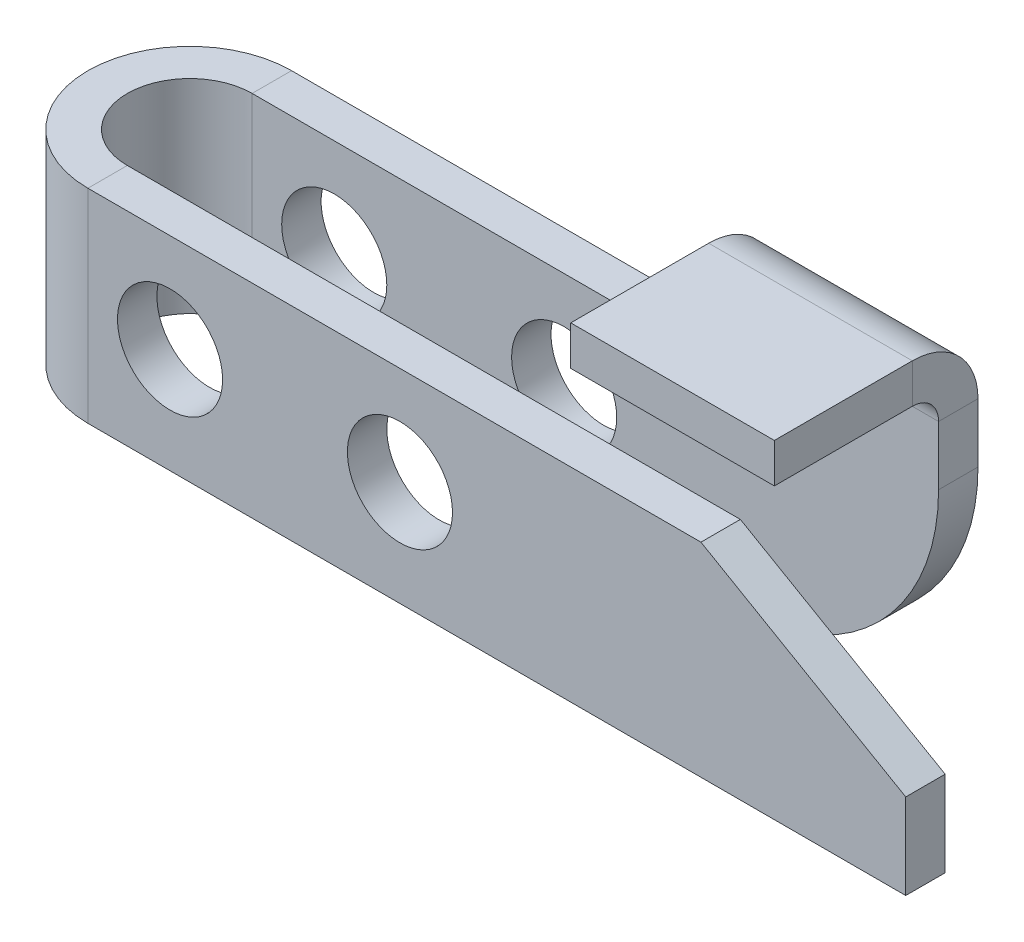
ISO-10303-21;
HEADER;
FILE_DESCRIPTION(('STEP AP214'),'2;1');
FILE_NAME('part.step','',(''),(''),'','','');
FILE_SCHEMA(('AUTOMOTIVE_DESIGN { 1 0 10303 214 1 1 1 1 }'));
ENDSEC;
DATA;
#1=APPLICATION_CONTEXT('core data for automotive mechanical design processes');
#2=APPLICATION_PROTOCOL_DEFINITION('international standard','automotive_design',2000,#1);
#3=PRODUCT_CONTEXT('',#1,'mechanical');
#4=PRODUCT('Part','Part','',(#3));
#5=PRODUCT_RELATED_PRODUCT_CATEGORY('part','',(#4));
#6=PRODUCT_DEFINITION_FORMATION('','',#4);
#7=PRODUCT_DEFINITION_CONTEXT('part definition',#1,'design');
#8=PRODUCT_DEFINITION('design','',#6,#7);
#9=PRODUCT_DEFINITION_SHAPE('','',#8);
#10=(LENGTH_UNIT() NAMED_UNIT(*) SI_UNIT(.MILLI.,.METRE.));
#11=(NAMED_UNIT(*) PLANE_ANGLE_UNIT() SI_UNIT($,.RADIAN.));
#12=(NAMED_UNIT(*) SI_UNIT($,.STERADIAN.) SOLID_ANGLE_UNIT());
#13=UNCERTAINTY_MEASURE_WITH_UNIT(LENGTH_MEASURE(1.E-05),#10,'distance_accuracy_value','');
#14=(GEOMETRIC_REPRESENTATION_CONTEXT(3) GLOBAL_UNCERTAINTY_ASSIGNED_CONTEXT((#13)) GLOBAL_UNIT_ASSIGNED_CONTEXT((#10,
#11,#12)) REPRESENTATION_CONTEXT('',''));
#15=CARTESIAN_POINT('',(0.,0.,0.));
#16=DIRECTION('',(0.,0.,1.));
#17=DIRECTION('',(1.,0.,0.));
#18=AXIS2_PLACEMENT_3D('',#15,#16,#17);
#19=CARTESIAN_POINT('',(-72.25,15.5,-31.));
#20=DIRECTION('',(0.,0.,-1.));
#21=DIRECTION('',(-1.,0.,0.));
#22=AXIS2_PLACEMENT_3D('',#19,#20,#21);
#23=PLANE('',#22);
#24=CARTESIAN_POINT('',(-112.,16.,-31.));
#25=DIRECTION('',(0.,0.,1.));
#26=DIRECTION('',(1.,0.,0.));
#27=AXIS2_PLACEMENT_3D('',#24,#25,#26);
#28=CIRCLE('',#27,8.00000000000001);
#29=CARTESIAN_POINT('',(-104.,16.,-31.));
#30=VERTEX_POINT('',#29);
#31=EDGE_CURVE('E771',#30,#30,#28,.T.);
#32=ORIENTED_EDGE('',*,*,#31,.T.);
#33=EDGE_LOOP('',(#32));
#34=FACE_BOUND('',#33,.T.);
#35=CARTESIAN_POINT('',(-77.,16.,-31.));
#36=DIRECTION('',(0.,0.,1.));
#37=DIRECTION('',(1.,0.,0.));
#38=AXIS2_PLACEMENT_3D('',#35,#36,#37);
#39=CIRCLE('',#38,8.00000000000001);
#40=CARTESIAN_POINT('',(-69.,16.,-31.));
#41=VERTEX_POINT('',#40);
#42=EDGE_CURVE('E776',#41,#41,#39,.T.);
#43=ORIENTED_EDGE('',*,*,#42,.T.);
#44=EDGE_LOOP('',(#43));
#45=FACE_BOUND('',#44,.T.);
#46=DIRECTION('',(0.,1.,0.));
#47=VECTOR('',#46,1.);
#48=CARTESIAN_POINT('',(-20.,15.5,-31.));
#49=LINE('',#48,#47);
#50=CARTESIAN_POINT('',(-20.,31.,-31.));
#51=VERTEX_POINT('',#50);
#52=CARTESIAN_POINT('',(-20.,40.,-31.));
#53=VERTEX_POINT('',#52);
#54=EDGE_CURVE('E265',#51,#53,#49,.T.);
#55=ORIENTED_EDGE('',*,*,#54,.F.);
#56=CARTESIAN_POINT('',(-51.,31.,-31.));
#57=DIRECTION('',(0.,0.,-1.));
#58=DIRECTION('',(-1.,0.,0.));
#59=AXIS2_PLACEMENT_3D('',#56,#57,#58);
#60=CIRCLE('',#59,31.);
#61=CARTESIAN_POINT('',(-51.,0.,-31.));
#62=VERTEX_POINT('',#61);
#63=EDGE_CURVE('E86',#51,#62,#60,.T.);
#64=ORIENTED_EDGE('',*,*,#63,.T.);
#65=DIRECTION('',(1.,0.,0.));
#66=VECTOR('',#65,1.);
#67=CARTESIAN_POINT('',(-72.25,0.,-31.));
#68=LINE('',#67,#66);
#69=CARTESIAN_POINT('',(-124.5,0.,-31.));
#70=VERTEX_POINT('',#69);
#71=EDGE_CURVE('E273',#70,#62,#68,.T.);
#72=ORIENTED_EDGE('',*,*,#71,.F.);
#73=DIRECTION('',(0.,-1.,0.));
#74=VECTOR('',#73,1.);
#75=CARTESIAN_POINT('',(-124.5,15.5,-31.));
#76=LINE('',#75,#74);
#77=CARTESIAN_POINT('',(-124.5,31.,-31.));
#78=VERTEX_POINT('',#77);
#79=EDGE_CURVE('E269',#78,#70,#76,.T.);
#80=ORIENTED_EDGE('',*,*,#79,.F.);
#81=DIRECTION('',(1.,0.,0.));
#82=VECTOR('',#81,1.);
#83=CARTESIAN_POINT('',(-72.25,31.,-31.));
#84=LINE('',#83,#82);
#85=CARTESIAN_POINT('',(-51.,31.,-31.));
#86=VERTEX_POINT('',#85);
#87=EDGE_CURVE('E206',#78,#86,#84,.T.);
#88=ORIENTED_EDGE('',*,*,#87,.T.);
#89=DIRECTION('',(0.,1.,0.));
#90=VECTOR('',#89,1.);
#91=CARTESIAN_POINT('',(-51.,15.5,-31.));
#92=LINE('',#91,#90);
#93=CARTESIAN_POINT('',(-51.,40.,-31.));
#94=VERTEX_POINT('',#93);
#95=EDGE_CURVE('E194',#86,#94,#92,.T.);
#96=ORIENTED_EDGE('',*,*,#95,.T.);
#97=DIRECTION('',(-1.,0.,0.));
#98=VECTOR('',#97,1.);
#99=CARTESIAN_POINT('',(-124.5,40.,-31.));
#100=LINE('',#99,#98);
#101=EDGE_CURVE('E203',#94,#53,#100,.F.);
#102=ORIENTED_EDGE('',*,*,#101,.T.);
#103=EDGE_LOOP('',(#55,#64,#72,#80,#88,#96,#102));
#104=FACE_BOUND('',#103,.T.);
#105=ADVANCED_FACE('F63',(#34,#45,#104),#23,.T.);
#106=CARTESIAN_POINT('',(-72.25,15.5,-25.));
#107=DIRECTION('',(0.,0.,-1.));
#108=DIRECTION('',(-1.,0.,0.));
#109=AXIS2_PLACEMENT_3D('',#106,#107,#108);
#110=PLANE('',#109);
#111=CARTESIAN_POINT('',(-112.,16.,-25.));
#112=DIRECTION('',(0.,0.,-1.));
#113=DIRECTION('',(-1.,0.,0.));
#114=AXIS2_PLACEMENT_3D('',#111,#112,#113);
#115=CIRCLE('',#114,8.00000000000001);
#116=CARTESIAN_POINT('',(-120.,16.,-25.));
#117=VERTEX_POINT('',#116);
#118=EDGE_CURVE('E721',#117,#117,#115,.T.);
#119=ORIENTED_EDGE('',*,*,#118,.T.);
#120=EDGE_LOOP('',(#119));
#121=FACE_BOUND('',#120,.T.);
#122=CARTESIAN_POINT('',(-77.,16.,-25.));
#123=DIRECTION('',(0.,0.,-1.));
#124=DIRECTION('',(-1.,0.,0.));
#125=AXIS2_PLACEMENT_3D('',#122,#123,#124);
#126=CIRCLE('',#125,8.00000000000001);
#127=CARTESIAN_POINT('',(-85.,16.,-25.));
#128=VERTEX_POINT('',#127);
#129=EDGE_CURVE('E761',#128,#128,#126,.T.);
#130=ORIENTED_EDGE('',*,*,#129,.T.);
#131=EDGE_LOOP('',(#130));
#132=FACE_BOUND('',#131,.T.);
#133=DIRECTION('',(-1.,0.,0.));
#134=VECTOR('',#133,1.);
#135=CARTESIAN_POINT('',(-72.25,0.,-25.));
#136=LINE('',#135,#134);
#137=CARTESIAN_POINT('',(-124.5,0.,-25.));
#138=VERTEX_POINT('',#137);
#139=CARTESIAN_POINT('',(-51.,0.,-25.));
#140=VERTEX_POINT('',#139);
#141=EDGE_CURVE('E261',#138,#140,#136,.F.);
#142=ORIENTED_EDGE('',*,*,#141,.T.);
#143=CARTESIAN_POINT('',(-51.,31.,-25.));
#144=DIRECTION('',(0.,0.,-1.));
#145=DIRECTION('',(-1.,0.,0.));
#146=AXIS2_PLACEMENT_3D('',#143,#144,#145);
#147=CIRCLE('',#146,31.);
#148=CARTESIAN_POINT('',(-20.,31.,-25.));
#149=VERTEX_POINT('',#148);
#150=EDGE_CURVE('E13',#140,#149,#147,.F.);
#151=ORIENTED_EDGE('',*,*,#150,.T.);
#152=DIRECTION('',(0.,1.,0.));
#153=VECTOR('',#152,1.);
#154=CARTESIAN_POINT('',(-20.,15.5,-25.));
#155=LINE('',#154,#153);
#156=CARTESIAN_POINT('',(-20.,40.,-25.));
#157=VERTEX_POINT('',#156);
#158=EDGE_CURVE('E276',#149,#157,#155,.T.);
#159=ORIENTED_EDGE('',*,*,#158,.T.);
#160=DIRECTION('',(-1.,0.,0.));
#161=VECTOR('',#160,1.);
#162=CARTESIAN_POINT('',(-124.5,40.,-25.));
#163=LINE('',#162,#161);
#164=CARTESIAN_POINT('',(-51.,40.,-25.));
#165=VERTEX_POINT('',#164);
#166=EDGE_CURVE('E222',#165,#157,#163,.F.);
#167=ORIENTED_EDGE('',*,*,#166,.F.);
#168=DIRECTION('',(0.,1.,0.));
#169=VECTOR('',#168,1.);
#170=CARTESIAN_POINT('',(-51.,35.5,-25.));
#171=LINE('',#170,#169);
#172=CARTESIAN_POINT('',(-51.,31.,-25.));
#173=VERTEX_POINT('',#172);
#174=EDGE_CURVE('E197',#173,#165,#171,.T.);
#175=ORIENTED_EDGE('',*,*,#174,.F.);
#176=DIRECTION('',(1.,0.,0.));
#177=VECTOR('',#176,1.);
#178=CARTESIAN_POINT('',(-87.75,31.,-25.));
#179=LINE('',#178,#177);
#180=CARTESIAN_POINT('',(-124.5,31.,-25.));
#181=VERTEX_POINT('',#180);
#182=EDGE_CURVE('E208',#181,#173,#179,.T.);
#183=ORIENTED_EDGE('',*,*,#182,.F.);
#184=DIRECTION('',(0.,1.,0.));
#185=VECTOR('',#184,1.);
#186=CARTESIAN_POINT('',(-124.5,15.5,-25.));
#187=LINE('',#186,#185);
#188=EDGE_CURVE('E279',#181,#138,#187,.F.);
#189=ORIENTED_EDGE('',*,*,#188,.T.);
#190=EDGE_LOOP('',(#142,#151,#159,#167,#175,#183,#189));
#191=FACE_BOUND('',#190,.T.);
#192=ADVANCED_FACE('F342',(#121,#132,#191),#110,.F.);
#193=CARTESIAN_POINT('',(-124.5,40.,-21.));
#194=DIRECTION('',(-1.,0.,0.));
#195=DIRECTION('',(0.,1.,0.));
#196=AXIS2_PLACEMENT_3D('',#193,#194,#195);
#197=CYLINDRICAL_SURFACE('',#196,10.);
#198=ORIENTED_EDGE('',*,*,#101,.F.);
#199=CARTESIAN_POINT('',(-51.,40.,-21.));
#200=DIRECTION('',(-1.,0.,0.));
#201=DIRECTION('',(0.,0.,1.));
#202=AXIS2_PLACEMENT_3D('',#199,#200,#201);
#203=CIRCLE('',#202,10.);
#204=CARTESIAN_POINT('',(-51.,50.,-21.));
#205=VERTEX_POINT('',#204);
#206=EDGE_CURVE('E176',#205,#94,#203,.T.);
#207=ORIENTED_EDGE('',*,*,#206,.F.);
#208=DIRECTION('',(-1.,0.,0.));
#209=VECTOR('',#208,1.);
#210=CARTESIAN_POINT('',(-20.,50.,-21.));
#211=LINE('',#210,#209);
#212=CARTESIAN_POINT('',(-20.,50.,-21.));
#213=VERTEX_POINT('',#212);
#214=EDGE_CURVE('E742',#205,#213,#211,.F.);
#215=ORIENTED_EDGE('',*,*,#214,.T.);
#216=CARTESIAN_POINT('',(-20.,40.,-21.));
#217=DIRECTION('',(-1.,0.,0.));
#218=DIRECTION('',(0.,0.,1.));
#219=AXIS2_PLACEMENT_3D('',#216,#217,#218);
#220=CIRCLE('',#219,10.);
#221=EDGE_CURVE('E212',#53,#213,#220,.F.);
#222=ORIENTED_EDGE('',*,*,#221,.F.);
#223=EDGE_LOOP('',(#198,#207,#215,#222));
#224=FACE_BOUND('',#223,.T.);
#225=ADVANCED_FACE('F210',(#224),#197,.T.);
#226=CARTESIAN_POINT('',(-124.5,40.,-21.));
#227=DIRECTION('',(-1.,0.,0.));
#228=DIRECTION('',(0.,1.,0.));
#229=AXIS2_PLACEMENT_3D('',#226,#227,#228);
#230=CYLINDRICAL_SURFACE('',#229,4.);
#231=CARTESIAN_POINT('',(-51.,40.,-21.));
#232=DIRECTION('',(-1.,0.,0.));
#233=DIRECTION('',(0.,0.,1.));
#234=AXIS2_PLACEMENT_3D('',#231,#232,#233);
#235=CIRCLE('',#234,4.);
#236=CARTESIAN_POINT('',(-51.,44.,-21.));
#237=VERTEX_POINT('',#236);
#238=EDGE_CURVE('E188',#237,#165,#235,.T.);
#239=ORIENTED_EDGE('',*,*,#238,.T.);
#240=ORIENTED_EDGE('',*,*,#166,.T.);
#241=CARTESIAN_POINT('',(-20.,40.,-21.));
#242=DIRECTION('',(-1.,0.,0.));
#243=DIRECTION('',(0.,0.,1.));
#244=AXIS2_PLACEMENT_3D('',#241,#242,#243);
#245=CIRCLE('',#244,4.);
#246=CARTESIAN_POINT('',(-20.,44.,-21.));
#247=VERTEX_POINT('',#246);
#248=EDGE_CURVE('E215',#157,#247,#245,.F.);
#249=ORIENTED_EDGE('',*,*,#248,.T.);
#250=DIRECTION('',(-1.,0.,0.));
#251=VECTOR('',#250,1.);
#252=CARTESIAN_POINT('',(-20.,44.,-21.));
#253=LINE('',#252,#251);
#254=EDGE_CURVE('E700',#247,#237,#253,.T.);
#255=ORIENTED_EDGE('',*,*,#254,.T.);
#256=EDGE_LOOP('',(#239,#240,#249,#255));
#257=FACE_BOUND('',#256,.T.);
#258=ADVANCED_FACE('F619',(#257),#230,.F.);
#259=CARTESIAN_POINT('',(0.,50.,-1.28501743543621E-13));
#260=DIRECTION('',(0.,-1.,0.));
#261=DIRECTION('',(0.,0.,-1.));
#262=AXIS2_PLACEMENT_3D('',#259,#260,#261);
#263=PLANE('',#262);
#264=DIRECTION('',(0.,0.,1.));
#265=VECTOR('',#264,1.);
#266=CARTESIAN_POINT('',(-51.,50.,-10.5000000000001));
#267=LINE('',#266,#265);
#268=CARTESIAN_POINT('',(-51.,50.,-1.28369537222284E-13));
#269=VERTEX_POINT('',#268);
#270=EDGE_CURVE('E719',#269,#205,#267,.F.);
#271=ORIENTED_EDGE('',*,*,#270,.F.);
#272=DIRECTION('',(1.,0.,0.));
#273=VECTOR('',#272,1.);
#274=CARTESIAN_POINT('',(0.,50.,-1.28501743543621E-13));
#275=LINE('',#274,#273);
#276=CARTESIAN_POINT('',(-20.,50.,0.));
#277=VERTEX_POINT('',#276);
#278=EDGE_CURVE('E728',#269,#277,#275,.T.);
#279=ORIENTED_EDGE('',*,*,#278,.T.);
#280=DIRECTION('',(0.,0.,-1.));
#281=VECTOR('',#280,1.);
#282=CARTESIAN_POINT('',(-20.,50.,-1.28501743543621E-13));
#283=LINE('',#282,#281);
#284=EDGE_CURVE('E731',#277,#213,#283,.T.);
#285=ORIENTED_EDGE('',*,*,#284,.T.);
#286=ORIENTED_EDGE('',*,*,#214,.F.);
#287=EDGE_LOOP('',(#271,#279,#285,#286));
#288=FACE_BOUND('',#287,.T.);
#289=ADVANCED_FACE('F608',(#288),#263,.F.);
#290=CARTESIAN_POINT('',(0.,44.,-1.07552855510562E-13));
#291=DIRECTION('',(0.,-1.,0.));
#292=DIRECTION('',(0.,0.,-1.));
#293=AXIS2_PLACEMENT_3D('',#290,#291,#292);
#294=PLANE('',#293);
#295=DIRECTION('',(-1.,0.,0.));
#296=VECTOR('',#295,1.);
#297=CARTESIAN_POINT('',(-20.,44.,0.));
#298=LINE('',#297,#296);
#299=CARTESIAN_POINT('',(-51.,44.,0.));
#300=VERTEX_POINT('',#299);
#301=CARTESIAN_POINT('',(-20.,44.,0.));
#302=VERTEX_POINT('',#301);
#303=EDGE_CURVE('E735',#300,#302,#298,.F.);
#304=ORIENTED_EDGE('',*,*,#303,.F.);
#305=DIRECTION('',(0.,0.,-1.));
#306=VECTOR('',#305,1.);
#307=CARTESIAN_POINT('',(-51.,44.,-31.));
#308=LINE('',#307,#306);
#309=EDGE_CURVE('E711',#300,#237,#308,.T.);
#310=ORIENTED_EDGE('',*,*,#309,.T.);
#311=ORIENTED_EDGE('',*,*,#254,.F.);
#312=DIRECTION('',(0.,0.,1.));
#313=VECTOR('',#312,1.);
#314=CARTESIAN_POINT('',(-20.,44.,-25.));
#315=LINE('',#314,#313);
#316=EDGE_CURVE('E738',#302,#247,#315,.F.);
#317=ORIENTED_EDGE('',*,*,#316,.F.);
#318=EDGE_LOOP('',(#304,#310,#311,#317));
#319=FACE_BOUND('',#318,.T.);
#320=ADVANCED_FACE('F597',(#319),#294,.T.);
#321=CARTESIAN_POINT('',(-20.,50.,0.));
#322=DIRECTION('',(0.,0.,-1.));
#323=DIRECTION('',(0.,1.,0.));
#324=AXIS2_PLACEMENT_3D('',#321,#322,#323);
#325=PLANE('',#324);
#326=DIRECTION('',(0.,1.,0.));
#327=VECTOR('',#326,1.);
#328=CARTESIAN_POINT('',(-51.,44.,-1.07685061831899E-13));
#329=LINE('',#328,#327);
#330=EDGE_CURVE('E705',#269,#300,#329,.F.);
#331=ORIENTED_EDGE('',*,*,#330,.T.);
#332=ORIENTED_EDGE('',*,*,#303,.T.);
#333=DIRECTION('',(0.,-1.,0.));
#334=VECTOR('',#333,1.);
#335=CARTESIAN_POINT('',(-20.,50.0000000000001,0.));
#336=LINE('',#335,#334);
#337=EDGE_CURVE('E231',#277,#302,#336,.T.);
#338=ORIENTED_EDGE('',*,*,#337,.F.);
#339=ORIENTED_EDGE('',*,*,#278,.F.);
#340=EDGE_LOOP('',(#331,#332,#338,#339));
#341=FACE_BOUND('',#340,.T.);
#342=ADVANCED_FACE('F424',(#341),#325,.F.);
#343=CARTESIAN_POINT('',(0.,31.,-6.));
#344=DIRECTION('',(0.,1.,0.));
#345=DIRECTION('',(-1.,0.,0.));
#346=AXIS2_PLACEMENT_3D('',#343,#344,#345);
#347=PLANE('',#346);
#348=DIRECTION('',(-1.,0.,0.));
#349=VECTOR('',#348,1.);
#350=CARTESIAN_POINT('',(0.,31.,0.));
#351=LINE('',#350,#349);
#352=CARTESIAN_POINT('',(-31.1769145362398,31.,0.));
#353=VERTEX_POINT('',#352);
#354=CARTESIAN_POINT('',(-124.5,31.,0.));
#355=VERTEX_POINT('',#354);
#356=EDGE_CURVE('E307',#353,#355,#351,.T.);
#357=ORIENTED_EDGE('',*,*,#356,.F.);
#358=DIRECTION('',(0.,0.,-1.));
#359=VECTOR('',#358,1.);
#360=CARTESIAN_POINT('',(-31.1769145362398,31.,-6.));
#361=LINE('',#360,#359);
#362=CARTESIAN_POINT('',(-31.1769145362398,31.,-6.));
#363=VERTEX_POINT('',#362);
#364=EDGE_CURVE('E322',#353,#363,#361,.T.);
#365=ORIENTED_EDGE('',*,*,#364,.T.);
#366=DIRECTION('',(-1.,0.,0.));
#367=VECTOR('',#366,1.);
#368=CARTESIAN_POINT('',(0.,31.,-6.));
#369=LINE('',#368,#367);
#370=CARTESIAN_POINT('',(-124.5,31.,-6.));
#371=VERTEX_POINT('',#370);
#372=EDGE_CURVE('E296',#363,#371,#369,.T.);
#373=ORIENTED_EDGE('',*,*,#372,.T.);
#374=DIRECTION('',(0.,0.,1.));
#375=VECTOR('',#374,1.);
#376=CARTESIAN_POINT('',(-124.5,31.,-6.));
#377=LINE('',#376,#375);
#378=EDGE_CURVE('E244',#371,#355,#377,.T.);
#379=ORIENTED_EDGE('',*,*,#378,.T.);
#380=EDGE_LOOP('',(#357,#365,#373,#379));
#381=FACE_BOUND('',#380,.T.);
#382=ADVANCED_FACE('F382',(#381),#347,.T.);
#383=CARTESIAN_POINT('',(0.,0.,-6.));
#384=DIRECTION('',(1.,0.,0.));
#385=DIRECTION('',(0.,0.,-1.));
#386=AXIS2_PLACEMENT_3D('',#383,#384,#385);
#387=PLANE('',#386);
#388=DIRECTION('',(0.,1.,0.));
#389=VECTOR('',#388,1.);
#390=CARTESIAN_POINT('',(0.,0.,-6.));
#391=LINE('',#390,#389);
#392=CARTESIAN_POINT('',(0.,0.,-6.));
#393=VERTEX_POINT('',#392);
#394=CARTESIAN_POINT('',(0.,13.,-6.));
#395=VERTEX_POINT('',#394);
#396=EDGE_CURVE('E292',#393,#395,#391,.T.);
#397=ORIENTED_EDGE('',*,*,#396,.T.);
#398=DIRECTION('',(0.,0.,1.));
#399=VECTOR('',#398,1.);
#400=CARTESIAN_POINT('',(0.,13.,-6.));
#401=LINE('',#400,#399);
#402=CARTESIAN_POINT('',(0.,13.,0.));
#403=VERTEX_POINT('',#402);
#404=EDGE_CURVE('E315',#395,#403,#401,.T.);
#405=ORIENTED_EDGE('',*,*,#404,.T.);
#406=DIRECTION('',(0.,1.,0.));
#407=VECTOR('',#406,1.);
#408=CARTESIAN_POINT('',(0.,0.,0.));
#409=LINE('',#408,#407);
#410=CARTESIAN_POINT('',(0.,0.,0.));
#411=VERTEX_POINT('',#410);
#412=EDGE_CURVE('E291',#411,#403,#409,.T.);
#413=ORIENTED_EDGE('',*,*,#412,.F.);
#414=DIRECTION('',(0.,0.,1.));
#415=VECTOR('',#414,1.);
#416=CARTESIAN_POINT('',(0.,0.,-6.));
#417=LINE('',#416,#415);
#418=EDGE_CURVE('E303',#393,#411,#417,.T.);
#419=ORIENTED_EDGE('',*,*,#418,.F.);
#420=EDGE_LOOP('',(#397,#405,#413,#419));
#421=FACE_BOUND('',#420,.T.);
#422=ADVANCED_FACE('F370',(#421),#387,.T.);
#423=CARTESIAN_POINT('',(0.,0.,-6.));
#424=DIRECTION('',(0.,-1.,0.));
#425=DIRECTION('',(0.,0.,-1.));
#426=AXIS2_PLACEMENT_3D('',#423,#424,#425);
#427=PLANE('',#426);
#428=DIRECTION('',(0.,0.,1.));
#429=VECTOR('',#428,1.);
#430=CARTESIAN_POINT('',(-124.5,0.,-6.));
#431=LINE('',#430,#429);
#432=CARTESIAN_POINT('',(-124.5,0.,-6.));
#433=VERTEX_POINT('',#432);
#434=CARTESIAN_POINT('',(-124.5,0.,0.));
#435=VERTEX_POINT('',#434);
#436=EDGE_CURVE('E258',#433,#435,#431,.T.);
#437=ORIENTED_EDGE('',*,*,#436,.F.);
#438=DIRECTION('',(1.,0.,0.));
#439=VECTOR('',#438,1.);
#440=CARTESIAN_POINT('',(0.,0.,-6.));
#441=LINE('',#440,#439);
#442=EDGE_CURVE('E300',#433,#393,#441,.T.);
#443=ORIENTED_EDGE('',*,*,#442,.T.);
#444=ORIENTED_EDGE('',*,*,#418,.T.);
#445=DIRECTION('',(1.,0.,0.));
#446=VECTOR('',#445,1.);
#447=CARTESIAN_POINT('',(0.,0.,0.));
#448=LINE('',#447,#446);
#449=EDGE_CURVE('E297',#435,#411,#448,.T.);
#450=ORIENTED_EDGE('',*,*,#449,.F.);
#451=EDGE_LOOP('',(#437,#443,#444,#450));
#452=FACE_BOUND('',#451,.T.);
#453=ADVANCED_FACE('F366',(#452),#427,.T.);
#454=CARTESIAN_POINT('',(0.,0.,-6.));
#455=DIRECTION('',(0.,0.,1.));
#456=DIRECTION('',(1.,0.,0.));
#457=AXIS2_PLACEMENT_3D('',#454,#455,#456);
#458=PLANE('',#457);
#459=CARTESIAN_POINT('',(-112.,16.,-6.));
#460=DIRECTION('',(0.,0.,1.));
#461=DIRECTION('',(1.,0.,0.));
#462=AXIS2_PLACEMENT_3D('',#459,#460,#461);
#463=CIRCLE('',#462,8.00000000000001);
#464=CARTESIAN_POINT('',(-104.,16.,-6.));
#465=VERTEX_POINT('',#464);
#466=EDGE_CURVE('E756',#465,#465,#463,.T.);
#467=ORIENTED_EDGE('',*,*,#466,.T.);
#468=EDGE_LOOP('',(#467));
#469=FACE_BOUND('',#468,.T.);
#470=CARTESIAN_POINT('',(-77.,16.,-6.));
#471=DIRECTION('',(0.,0.,1.));
#472=DIRECTION('',(1.,0.,0.));
#473=AXIS2_PLACEMENT_3D('',#470,#471,#472);
#474=CIRCLE('',#473,8.00000000000001);
#475=CARTESIAN_POINT('',(-69.,16.,-6.));
#476=VERTEX_POINT('',#475);
#477=EDGE_CURVE('E767',#476,#476,#474,.T.);
#478=ORIENTED_EDGE('',*,*,#477,.T.);
#479=EDGE_LOOP('',(#478));
#480=FACE_BOUND('',#479,.T.);
#481=ORIENTED_EDGE('',*,*,#372,.F.);
#482=DIRECTION('',(-0.866025403784438,0.500000000000001,0.));
#483=VECTOR('',#482,1.);
#484=CARTESIAN_POINT('',(0.,13.,-6.));
#485=LINE('',#484,#483);
#486=EDGE_CURVE('E325',#363,#395,#485,.F.);
#487=ORIENTED_EDGE('',*,*,#486,.T.);
#488=ORIENTED_EDGE('',*,*,#396,.F.);
#489=ORIENTED_EDGE('',*,*,#442,.F.);
#490=DIRECTION('',(0.,1.,0.));
#491=VECTOR('',#490,1.);
#492=CARTESIAN_POINT('',(-124.5,31.,-6.));
#493=LINE('',#492,#491);
#494=EDGE_CURVE('E252',#371,#433,#493,.F.);
#495=ORIENTED_EDGE('',*,*,#494,.F.);
#496=EDGE_LOOP('',(#481,#487,#488,#489,#495));
#497=FACE_BOUND('',#496,.T.);
#498=ADVANCED_FACE('F361',(#469,#480,#497),#458,.F.);
#499=CARTESIAN_POINT('',(0.,0.,0.));
#500=DIRECTION('',(0.,0.,1.));
#501=DIRECTION('',(1.,0.,0.));
#502=AXIS2_PLACEMENT_3D('',#499,#500,#501);
#503=PLANE('',#502);
#504=CARTESIAN_POINT('',(-112.,16.,0.));
#505=DIRECTION('',(0.,0.,1.));
#506=DIRECTION('',(1.,0.,0.));
#507=AXIS2_PLACEMENT_3D('',#504,#505,#506);
#508=CIRCLE('',#507,8.00000000000001);
#509=CARTESIAN_POINT('',(-104.,16.,0.));
#510=VERTEX_POINT('',#509);
#511=EDGE_CURVE('E780',#510,#510,#508,.T.);
#512=ORIENTED_EDGE('',*,*,#511,.F.);
#513=EDGE_LOOP('',(#512));
#514=FACE_BOUND('',#513,.T.);
#515=CARTESIAN_POINT('',(-77.,16.,0.));
#516=DIRECTION('',(0.,0.,1.));
#517=DIRECTION('',(1.,0.,0.));
#518=AXIS2_PLACEMENT_3D('',#515,#516,#517);
#519=CIRCLE('',#518,8.00000000000001);
#520=CARTESIAN_POINT('',(-69.,16.,0.));
#521=VERTEX_POINT('',#520);
#522=EDGE_CURVE('E772',#521,#521,#519,.T.);
#523=ORIENTED_EDGE('',*,*,#522,.F.);
#524=EDGE_LOOP('',(#523));
#525=FACE_BOUND('',#524,.T.);
#526=ORIENTED_EDGE('',*,*,#412,.T.);
#527=DIRECTION('',(0.866025403784438,-0.500000000000001,0.));
#528=VECTOR('',#527,1.);
#529=CARTESIAN_POINT('',(5.62916512459884,9.74999999999995,0.));
#530=LINE('',#529,#528);
#531=EDGE_CURVE('E319',#403,#353,#530,.F.);
#532=ORIENTED_EDGE('',*,*,#531,.T.);
#533=ORIENTED_EDGE('',*,*,#356,.T.);
#534=DIRECTION('',(0.,1.,0.));
#535=VECTOR('',#534,1.);
#536=CARTESIAN_POINT('',(-124.5,31.,0.));
#537=LINE('',#536,#535);
#538=EDGE_CURVE('E235',#355,#435,#537,.F.);
#539=ORIENTED_EDGE('',*,*,#538,.T.);
#540=ORIENTED_EDGE('',*,*,#449,.T.);
#541=EDGE_LOOP('',(#526,#532,#533,#539,#540));
#542=FACE_BOUND('',#541,.T.);
#543=ADVANCED_FACE('F373',(#514,#525,#542),#503,.T.);
#544=CARTESIAN_POINT('',(-20.,15.5,-31.));
#545=DIRECTION('',(-1.,0.,0.));
#546=DIRECTION('',(0.,1.,0.));
#547=AXIS2_PLACEMENT_3D('',#544,#545,#546);
#548=PLANE('',#547);
#549=ORIENTED_EDGE('',*,*,#158,.F.);
#550=DIRECTION('',(0.,0.,1.));
#551=VECTOR('',#550,1.);
#552=CARTESIAN_POINT('',(-20.,31.,-31.));
#553=LINE('',#552,#551);
#554=EDGE_CURVE('E328',#149,#51,#553,.F.);
#555=ORIENTED_EDGE('',*,*,#554,.T.);
#556=ORIENTED_EDGE('',*,*,#54,.T.);
#557=DIRECTION('',(0.,0.,-1.));
#558=VECTOR('',#557,1.);
#559=CARTESIAN_POINT('',(-20.,40.,-25.));
#560=LINE('',#559,#558);
#561=EDGE_CURVE('E219',#157,#53,#560,.T.);
#562=ORIENTED_EDGE('',*,*,#561,.F.);
#563=EDGE_LOOP('',(#549,#555,#556,#562));
#564=FACE_BOUND('',#563,.T.);
#565=ADVANCED_FACE('F337',(#564),#548,.F.);
#566=CARTESIAN_POINT('',(-72.25,0.,-31.));
#567=DIRECTION('',(0.,1.,0.));
#568=DIRECTION('',(1.,0.,0.));
#569=AXIS2_PLACEMENT_3D('',#566,#567,#568);
#570=PLANE('',#569);
#571=ORIENTED_EDGE('',*,*,#71,.T.);
#572=DIRECTION('',(0.,0.,1.));
#573=VECTOR('',#572,1.);
#574=CARTESIAN_POINT('',(-51.,0.,-31.));
#575=LINE('',#574,#573);
#576=EDGE_CURVE('E72',#62,#140,#575,.T.);
#577=ORIENTED_EDGE('',*,*,#576,.T.);
#578=ORIENTED_EDGE('',*,*,#141,.F.);
#579=DIRECTION('',(0.,0.,-1.));
#580=VECTOR('',#579,1.);
#581=CARTESIAN_POINT('',(-124.5,0.,-31.));
#582=LINE('',#581,#580);
#583=EDGE_CURVE('E287',#138,#70,#582,.T.);
#584=ORIENTED_EDGE('',*,*,#583,.T.);
#585=EDGE_LOOP('',(#571,#577,#578,#584));
#586=FACE_BOUND('',#585,.T.);
#587=ADVANCED_FACE('F347',(#586),#570,.F.);
#588=CARTESIAN_POINT('',(-124.5,0.,-15.5));
#589=DIRECTION('',(0.,-1.,0.));
#590=DIRECTION('',(0.,0.,-1.));
#591=AXIS2_PLACEMENT_3D('',#588,#589,#590);
#592=PLANE('',#591);
#593=ORIENTED_EDGE('',*,*,#583,.F.);
#594=CARTESIAN_POINT('',(-124.5,0.,-15.5));
#595=DIRECTION('',(0.,1.,0.));
#596=DIRECTION('',(0.,0.,1.));
#597=AXIS2_PLACEMENT_3D('',#594,#595,#596);
#598=CIRCLE('',#597,9.5);
#599=EDGE_CURVE('E248',#433,#138,#598,.F.);
#600=ORIENTED_EDGE('',*,*,#599,.F.);
#601=ORIENTED_EDGE('',*,*,#436,.T.);
#602=CARTESIAN_POINT('',(-124.5,0.,-15.5));
#603=DIRECTION('',(0.,1.,0.));
#604=DIRECTION('',(0.,0.,1.));
#605=AXIS2_PLACEMENT_3D('',#602,#603,#604);
#606=CIRCLE('',#605,15.5);
#607=EDGE_CURVE('E239',#435,#70,#606,.F.);
#608=ORIENTED_EDGE('',*,*,#607,.T.);
#609=EDGE_LOOP('',(#593,#600,#601,#608));
#610=FACE_BOUND('',#609,.T.);
#611=ADVANCED_FACE('F350',(#610),#592,.T.);
#612=CARTESIAN_POINT('',(-124.5,31.,-15.5));
#613=DIRECTION('',(0.,-1.,0.));
#614=DIRECTION('',(0.,0.,-1.));
#615=AXIS2_PLACEMENT_3D('',#612,#613,#614);
#616=PLANE('',#615);
#617=CARTESIAN_POINT('',(-124.5,31.,-15.5));
#618=DIRECTION('',(0.,1.,0.));
#619=DIRECTION('',(0.,0.,1.));
#620=AXIS2_PLACEMENT_3D('',#617,#618,#619);
#621=CIRCLE('',#620,9.5);
#622=EDGE_CURVE('E234',#181,#371,#621,.T.);
#623=ORIENTED_EDGE('',*,*,#622,.F.);
#624=DIRECTION('',(0.,0.,-1.));
#625=VECTOR('',#624,1.);
#626=CARTESIAN_POINT('',(-124.5,31.,-31.));
#627=LINE('',#626,#625);
#628=EDGE_CURVE('E268',#181,#78,#627,.T.);
#629=ORIENTED_EDGE('',*,*,#628,.T.);
#630=CARTESIAN_POINT('',(-124.5,31.,-15.5));
#631=DIRECTION('',(0.,1.,0.));
#632=DIRECTION('',(0.,0.,1.));
#633=AXIS2_PLACEMENT_3D('',#630,#631,#632);
#634=CIRCLE('',#633,15.5);
#635=EDGE_CURVE('E240',#78,#355,#634,.T.);
#636=ORIENTED_EDGE('',*,*,#635,.T.);
#637=ORIENTED_EDGE('',*,*,#378,.F.);
#638=EDGE_LOOP('',(#623,#629,#636,#637));
#639=FACE_BOUND('',#638,.T.);
#640=ADVANCED_FACE('F380',(#639),#616,.F.);
#641=CARTESIAN_POINT('',(-124.5,31.,-15.5));
#642=DIRECTION('',(0.,1.,0.));
#643=DIRECTION('',(0.,0.,-1.));
#644=AXIS2_PLACEMENT_3D('',#641,#642,#643);
#645=CYLINDRICAL_SURFACE('',#644,15.5);
#646=ORIENTED_EDGE('',*,*,#538,.F.);
#647=ORIENTED_EDGE('',*,*,#635,.F.);
#648=ORIENTED_EDGE('',*,*,#79,.T.);
#649=ORIENTED_EDGE('',*,*,#607,.F.);
#650=EDGE_LOOP('',(#646,#647,#648,#649));
#651=FACE_BOUND('',#650,.T.);
#652=ADVANCED_FACE('F378',(#651),#645,.T.);
#653=CARTESIAN_POINT('',(-124.5,31.,-15.5));
#654=DIRECTION('',(0.,1.,0.));
#655=DIRECTION('',(0.,0.,-1.));
#656=AXIS2_PLACEMENT_3D('',#653,#654,#655);
#657=CYLINDRICAL_SURFACE('',#656,9.5);
#658=ORIENTED_EDGE('',*,*,#494,.T.);
#659=ORIENTED_EDGE('',*,*,#599,.T.);
#660=ORIENTED_EDGE('',*,*,#188,.F.);
#661=ORIENTED_EDGE('',*,*,#622,.T.);
#662=EDGE_LOOP('',(#658,#659,#660,#661));
#663=FACE_BOUND('',#662,.T.);
#664=ADVANCED_FACE('F354',(#663),#657,.F.);
#665=CARTESIAN_POINT('',(-20.,40.,-21.));
#666=DIRECTION('',(1.,0.,0.));
#667=DIRECTION('',(0.,0.,-1.));
#668=AXIS2_PLACEMENT_3D('',#665,#666,#667);
#669=PLANE('',#668);
#670=DIRECTION('',(0.,-1.,0.));
#671=VECTOR('',#670,1.);
#672=CARTESIAN_POINT('',(-20.,50.,-21.));
#673=LINE('',#672,#671);
#674=EDGE_CURVE('E225',#247,#213,#673,.F.);
#675=ORIENTED_EDGE('',*,*,#674,.F.);
#676=ORIENTED_EDGE('',*,*,#248,.F.);
#677=ORIENTED_EDGE('',*,*,#561,.T.);
#678=ORIENTED_EDGE('',*,*,#221,.T.);
#679=EDGE_LOOP('',(#675,#676,#677,#678));
#680=FACE_BOUND('',#679,.T.);
#681=ADVANCED_FACE('F477',(#680),#669,.T.);
#682=CARTESIAN_POINT('',(-20.,50.,-25.));
#683=DIRECTION('',(-1.,0.,0.));
#684=DIRECTION('',(0.,0.,1.));
#685=AXIS2_PLACEMENT_3D('',#682,#683,#684);
#686=PLANE('',#685);
#687=ORIENTED_EDGE('',*,*,#674,.T.);
#688=ORIENTED_EDGE('',*,*,#284,.F.);
#689=ORIENTED_EDGE('',*,*,#337,.T.);
#690=ORIENTED_EDGE('',*,*,#316,.T.);
#691=EDGE_LOOP('',(#687,#688,#689,#690));
#692=FACE_BOUND('',#691,.T.);
#693=ADVANCED_FACE('F484',(#692),#686,.F.);
#694=CARTESIAN_POINT('',(-72.25,31.,-31.));
#695=DIRECTION('',(0.,-1.,0.));
#696=DIRECTION('',(1.,0.,0.));
#697=AXIS2_PLACEMENT_3D('',#694,#695,#696);
#698=PLANE('',#697);
#699=ORIENTED_EDGE('',*,*,#628,.F.);
#700=ORIENTED_EDGE('',*,*,#182,.T.);
#701=DIRECTION('',(0.,0.,1.));
#702=VECTOR('',#701,1.);
#703=CARTESIAN_POINT('',(-51.,31.,-31.));
#704=LINE('',#703,#702);
#705=EDGE_CURVE('E199',#173,#86,#704,.F.);
#706=ORIENTED_EDGE('',*,*,#705,.T.);
#707=ORIENTED_EDGE('',*,*,#87,.F.);
#708=EDGE_LOOP('',(#699,#700,#706,#707));
#709=FACE_BOUND('',#708,.T.);
#710=ADVANCED_FACE('F492',(#709),#698,.F.);
#711=CARTESIAN_POINT('',(-51.,15.5,-31.));
#712=DIRECTION('',(1.,0.,0.));
#713=DIRECTION('',(0.,1.,0.));
#714=AXIS2_PLACEMENT_3D('',#711,#712,#713);
#715=PLANE('',#714);
#716=ORIENTED_EDGE('',*,*,#705,.F.);
#717=ORIENTED_EDGE('',*,*,#174,.T.);
#718=DIRECTION('',(0.,0.,1.));
#719=VECTOR('',#718,1.);
#720=CARTESIAN_POINT('',(-51.,40.,-31.));
#721=LINE('',#720,#719);
#722=EDGE_CURVE('E180',#94,#165,#721,.T.);
#723=ORIENTED_EDGE('',*,*,#722,.F.);
#724=ORIENTED_EDGE('',*,*,#95,.F.);
#725=EDGE_LOOP('',(#716,#717,#723,#724));
#726=FACE_BOUND('',#725,.T.);
#727=ADVANCED_FACE('F193',(#726),#715,.F.);
#728=CARTESIAN_POINT('',(-51.,40.,-21.));
#729=DIRECTION('',(1.,0.,0.));
#730=DIRECTION('',(0.,0.,-1.));
#731=AXIS2_PLACEMENT_3D('',#728,#729,#730);
#732=PLANE('',#731);
#733=DIRECTION('',(0.,-1.,0.));
#734=VECTOR('',#733,1.);
#735=CARTESIAN_POINT('',(-51.,50.,-21.));
#736=LINE('',#735,#734);
#737=EDGE_CURVE('E182',#205,#237,#736,.T.);
#738=ORIENTED_EDGE('',*,*,#737,.F.);
#739=ORIENTED_EDGE('',*,*,#206,.T.);
#740=ORIENTED_EDGE('',*,*,#722,.T.);
#741=ORIENTED_EDGE('',*,*,#238,.F.);
#742=EDGE_LOOP('',(#738,#739,#740,#741));
#743=FACE_BOUND('',#742,.T.);
#744=ADVANCED_FACE('F178',(#743),#732,.F.);
#745=CARTESIAN_POINT('',(-51.,44.,-31.));
#746=DIRECTION('',(1.,0.,0.));
#747=DIRECTION('',(0.,0.,-1.));
#748=AXIS2_PLACEMENT_3D('',#745,#746,#747);
#749=PLANE('',#748);
#750=ORIENTED_EDGE('',*,*,#270,.T.);
#751=ORIENTED_EDGE('',*,*,#737,.T.);
#752=ORIENTED_EDGE('',*,*,#309,.F.);
#753=ORIENTED_EDGE('',*,*,#330,.F.);
#754=EDGE_LOOP('',(#750,#751,#752,#753));
#755=FACE_BOUND('',#754,.T.);
#756=ADVANCED_FACE('F513',(#755),#749,.F.);
#757=CARTESIAN_POINT('',(-77.,16.,-31.));
#758=DIRECTION('',(0.,0.,1.));
#759=DIRECTION('',(1.,0.,0.));
#760=AXIS2_PLACEMENT_3D('',#757,#758,#759);
#761=CYLINDRICAL_SURFACE('',#760,8.00000000000001);
#762=ORIENTED_EDGE('',*,*,#522,.T.);
#763=EDGE_LOOP('',(#762));
#764=FACE_BOUND('',#763,.T.);
#765=ORIENTED_EDGE('',*,*,#477,.F.);
#766=EDGE_LOOP('',(#765));
#767=FACE_BOUND('',#766,.T.);
#768=ADVANCED_FACE('F520',(#764,#767),#761,.F.);
#769=CARTESIAN_POINT('',(-112.,16.,-31.));
#770=DIRECTION('',(0.,0.,1.));
#771=DIRECTION('',(1.,0.,0.));
#772=AXIS2_PLACEMENT_3D('',#769,#770,#771);
#773=CYLINDRICAL_SURFACE('',#772,8.00000000000001);
#774=ORIENTED_EDGE('',*,*,#511,.T.);
#775=EDGE_LOOP('',(#774));
#776=FACE_BOUND('',#775,.T.);
#777=ORIENTED_EDGE('',*,*,#466,.F.);
#778=EDGE_LOOP('',(#777));
#779=FACE_BOUND('',#778,.T.);
#780=ADVANCED_FACE('F395',(#776,#779),#773,.F.);
#781=ORIENTED_EDGE('',*,*,#42,.F.);
#782=EDGE_LOOP('',(#781));
#783=FACE_BOUND('',#782,.T.);
#784=ORIENTED_EDGE('',*,*,#129,.F.);
#785=EDGE_LOOP('',(#784));
#786=FACE_BOUND('',#785,.T.);
#787=ADVANCED_FACE('F392',(#783,#786),#761,.F.);
#788=ORIENTED_EDGE('',*,*,#31,.F.);
#789=EDGE_LOOP('',(#788));
#790=FACE_BOUND('',#789,.T.);
#791=ORIENTED_EDGE('',*,*,#118,.F.);
#792=EDGE_LOOP('',(#791));
#793=FACE_BOUND('',#792,.T.);
#794=ADVANCED_FACE('F387',(#790,#793),#773,.F.);
#795=CARTESIAN_POINT('',(0.,13.,-6.));
#796=DIRECTION('',(-0.500000000000001,-0.866025403784438,0.));
#797=DIRECTION('',(0.,0.,1.));
#798=AXIS2_PLACEMENT_3D('',#795,#796,#797);
#799=PLANE('',#798);
#800=ORIENTED_EDGE('',*,*,#486,.F.);
#801=ORIENTED_EDGE('',*,*,#364,.F.);
#802=ORIENTED_EDGE('',*,*,#531,.F.);
#803=ORIENTED_EDGE('',*,*,#404,.F.);
#804=EDGE_LOOP('',(#800,#801,#802,#803));
#805=FACE_BOUND('',#804,.T.);
#806=ADVANCED_FACE('F385',(#805),#799,.F.);
#807=CARTESIAN_POINT('',(-51.,31.,-31.));
#808=DIRECTION('',(0.,0.,-1.));
#809=DIRECTION('',(-1.,0.,0.));
#810=AXIS2_PLACEMENT_3D('',#807,#808,#809);
#811=CYLINDRICAL_SURFACE('',#810,31.);
#812=ORIENTED_EDGE('',*,*,#150,.F.);
#813=ORIENTED_EDGE('',*,*,#576,.F.);
#814=ORIENTED_EDGE('',*,*,#63,.F.);
#815=ORIENTED_EDGE('',*,*,#554,.F.);
#816=EDGE_LOOP('',(#812,#813,#814,#815));
#817=FACE_BOUND('',#816,.T.);
#818=ADVANCED_FACE('F65',(#817),#811,.T.);
#819=CLOSED_SHELL('',(#105,#192,#225,#258,#289,#320,#342,#382,#422,#453,#498,#543,#565,#587,
#611,#640,#652,#664,#681,#693,#710,#727,#744,#756,#768,#780,#787,#794,#806,#818));
#820=MANIFOLD_SOLID_BREP('B2',#819);
#821=ADVANCED_BREP_SHAPE_REPRESENTATION('',(#18,#820),#14);
#822=SHAPE_DEFINITION_REPRESENTATION(#9,#821);
ENDSEC;
END-ISO-10303-21;
